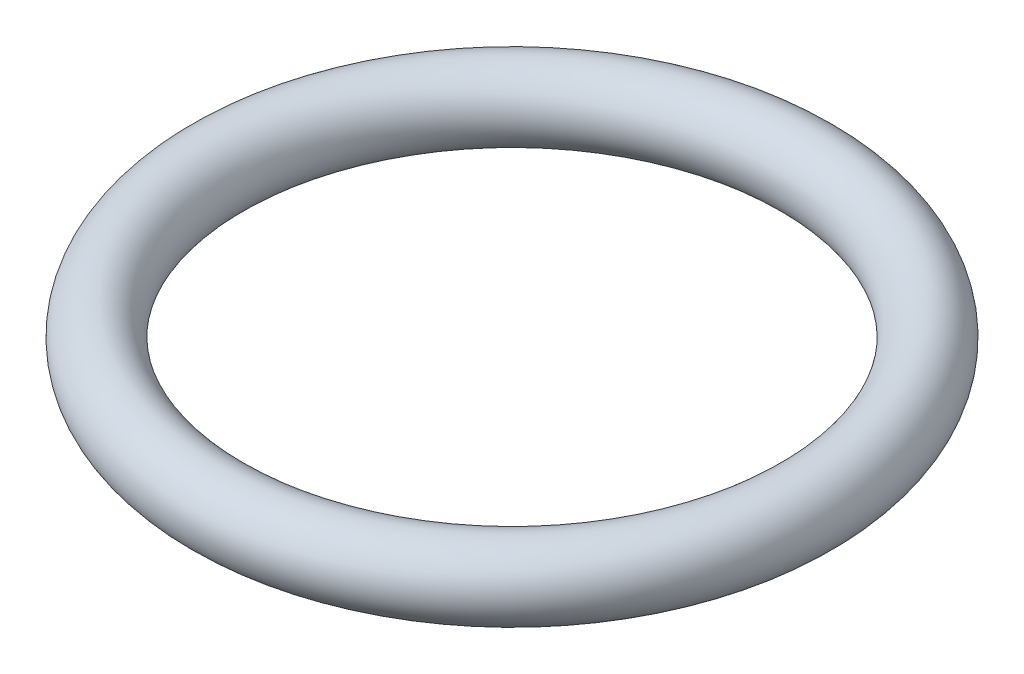
ISO-10303-21;
HEADER;
FILE_DESCRIPTION(('STEP AP214'),'2;1');
FILE_NAME('part.step','',(''),(''),'','','');
FILE_SCHEMA(('AUTOMOTIVE_DESIGN { 1 0 10303 214 1 1 1 1 }'));
ENDSEC;
DATA;
#1=APPLICATION_CONTEXT('core data for automotive mechanical design processes');
#2=APPLICATION_PROTOCOL_DEFINITION('international standard','automotive_design',2000,#1);
#3=PRODUCT_CONTEXT('',#1,'mechanical');
#4=PRODUCT('Part','Part','',(#3));
#5=PRODUCT_RELATED_PRODUCT_CATEGORY('part','',(#4));
#6=PRODUCT_DEFINITION_FORMATION('','',#4);
#7=PRODUCT_DEFINITION_CONTEXT('part definition',#1,'design');
#8=PRODUCT_DEFINITION('design','',#6,#7);
#9=PRODUCT_DEFINITION_SHAPE('','',#8);
#10=(LENGTH_UNIT() NAMED_UNIT(*) SI_UNIT(.MILLI.,.METRE.));
#11=(NAMED_UNIT(*) PLANE_ANGLE_UNIT() SI_UNIT($,.RADIAN.));
#12=(NAMED_UNIT(*) SI_UNIT($,.STERADIAN.) SOLID_ANGLE_UNIT());
#13=UNCERTAINTY_MEASURE_WITH_UNIT(LENGTH_MEASURE(1.E-05),#10,'distance_accuracy_value','');
#14=(GEOMETRIC_REPRESENTATION_CONTEXT(3) GLOBAL_UNCERTAINTY_ASSIGNED_CONTEXT((#13)) GLOBAL_UNIT_ASSIGNED_CONTEXT((#10,
#11,#12)) REPRESENTATION_CONTEXT('',''));
#15=CARTESIAN_POINT('',(0.,0.,0.));
#16=DIRECTION('',(0.,0.,1.));
#17=DIRECTION('',(1.,0.,0.));
#18=AXIS2_PLACEMENT_3D('',#15,#16,#17);
#19=CARTESIAN_POINT('',(0.,0.,0.));
#20=DIRECTION('',(0.,-1.,0.));
#21=DIRECTION('',(0.,0.,-1.));
#22=AXIS2_PLACEMENT_3D('',#19,#20,#21);
#23=TOROIDAL_SURFACE('',#22,7.,0.85);
#24=CARTESIAN_POINT('',(0.,0.,-7.85));
#25=VERTEX_POINT('',#24);
#26=VERTEX_LOOP('',#25);
#27=FACE_BOUND('',#26,.T.);
#28=ADVANCED_FACE('F29',(#27),#23,.T.);
#29=CLOSED_SHELL('',(#28));
#30=MANIFOLD_SOLID_BREP('B2',#29);
#31=ADVANCED_BREP_SHAPE_REPRESENTATION('',(#18,#30),#14);
#32=SHAPE_DEFINITION_REPRESENTATION(#9,#31);
ENDSEC;
END-ISO-10303-21;
